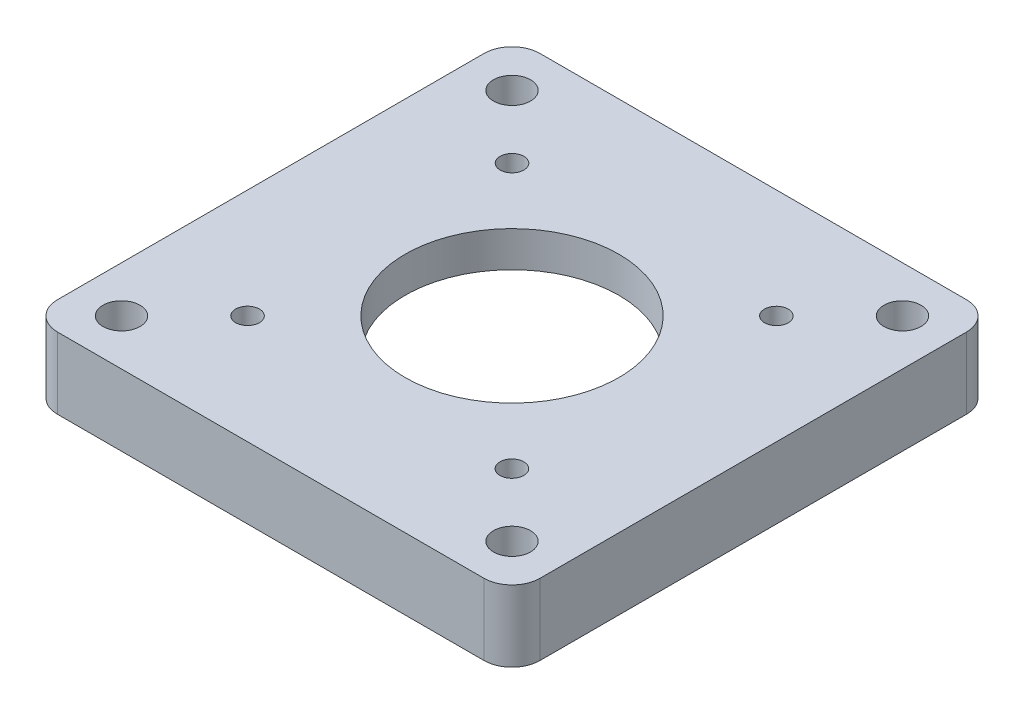
ISO-10303-21;
HEADER;
FILE_DESCRIPTION(('STEP AP214'),'2;1');
FILE_NAME('part.step','',(''),(''),'','','');
FILE_SCHEMA(('AUTOMOTIVE_DESIGN { 1 0 10303 214 1 1 1 1 }'));
ENDSEC;
DATA;
#1=APPLICATION_CONTEXT('core data for automotive mechanical design processes');
#2=APPLICATION_PROTOCOL_DEFINITION('international standard','automotive_design',2000,#1);
#3=PRODUCT_CONTEXT('',#1,'mechanical');
#4=PRODUCT('Part','Part','',(#3));
#5=PRODUCT_RELATED_PRODUCT_CATEGORY('part','',(#4));
#6=PRODUCT_DEFINITION_FORMATION('','',#4);
#7=PRODUCT_DEFINITION_CONTEXT('part definition',#1,'design');
#8=PRODUCT_DEFINITION('design','',#6,#7);
#9=PRODUCT_DEFINITION_SHAPE('','',#8);
#10=(LENGTH_UNIT() NAMED_UNIT(*) SI_UNIT(.MILLI.,.METRE.));
#11=(NAMED_UNIT(*) PLANE_ANGLE_UNIT() SI_UNIT($,.RADIAN.));
#12=(NAMED_UNIT(*) SI_UNIT($,.STERADIAN.) SOLID_ANGLE_UNIT());
#13=UNCERTAINTY_MEASURE_WITH_UNIT(LENGTH_MEASURE(1.E-05),#10,'distance_accuracy_value','');
#14=(GEOMETRIC_REPRESENTATION_CONTEXT(3) GLOBAL_UNCERTAINTY_ASSIGNED_CONTEXT((#13)) GLOBAL_UNIT_ASSIGNED_CONTEXT((#10,
#11,#12)) REPRESENTATION_CONTEXT('',''));
#15=CARTESIAN_POINT('',(0.,0.,0.));
#16=DIRECTION('',(0.,0.,1.));
#17=DIRECTION('',(1.,0.,0.));
#18=AXIS2_PLACEMENT_3D('',#15,#16,#17);
#19=CARTESIAN_POINT('',(0.,-6.35,0.));
#20=DIRECTION('',(0.,1.,0.));
#21=DIRECTION('',(0.,0.,1.));
#22=AXIS2_PLACEMENT_3D('',#19,#20,#21);
#23=PLANE('',#22);
#24=CARTESIAN_POINT('',(34.8,-6.35,-34.8));
#25=DIRECTION('',(0.,-1.,0.));
#26=DIRECTION('',(0.,0.,-1.));
#27=AXIS2_PLACEMENT_3D('',#24,#25,#26);
#28=CIRCLE('',#27,3.29999999999998);
#29=CARTESIAN_POINT('',(34.8,-6.35,-38.1));
#30=VERTEX_POINT('',#29);
#31=EDGE_CURVE('E664',#30,#30,#28,.T.);
#32=ORIENTED_EDGE('',*,*,#31,.F.);
#33=EDGE_LOOP('',(#32));
#34=FACE_BOUND('',#33,.T.);
#35=CARTESIAN_POINT('',(34.8,-6.35,34.8));
#36=DIRECTION('',(0.,-1.,0.));
#37=DIRECTION('',(0.,0.,-1.));
#38=AXIS2_PLACEMENT_3D('',#35,#36,#37);
#39=CIRCLE('',#38,3.29999999999998);
#40=CARTESIAN_POINT('',(34.8,-6.35,31.5));
#41=VERTEX_POINT('',#40);
#42=EDGE_CURVE('E677',#41,#41,#39,.T.);
#43=ORIENTED_EDGE('',*,*,#42,.F.);
#44=EDGE_LOOP('',(#43));
#45=FACE_BOUND('',#44,.T.);
#46=CARTESIAN_POINT('',(-34.8,-6.35,34.8));
#47=DIRECTION('',(0.,-1.,0.));
#48=DIRECTION('',(0.,0.,-1.));
#49=AXIS2_PLACEMENT_3D('',#46,#47,#48);
#50=CIRCLE('',#49,3.29999999999998);
#51=CARTESIAN_POINT('',(-34.8,-6.35,31.5));
#52=VERTEX_POINT('',#51);
#53=EDGE_CURVE('E682',#52,#52,#50,.T.);
#54=ORIENTED_EDGE('',*,*,#53,.F.);
#55=EDGE_LOOP('',(#54));
#56=FACE_BOUND('',#55,.T.);
#57=CARTESIAN_POINT('',(-34.8,-6.35,-34.8));
#58=DIRECTION('',(0.,-1.,0.));
#59=DIRECTION('',(0.,0.,-1.));
#60=AXIS2_PLACEMENT_3D('',#57,#58,#59);
#61=CIRCLE('',#60,3.29999999999998);
#62=CARTESIAN_POINT('',(-34.8,-6.35,-38.1));
#63=VERTEX_POINT('',#62);
#64=EDGE_CURVE('E693',#63,#63,#61,.T.);
#65=ORIENTED_EDGE('',*,*,#64,.F.);
#66=EDGE_LOOP('',(#65));
#67=FACE_BOUND('',#66,.T.);
#68=DIRECTION('',(1.,0.,0.));
#69=VECTOR('',#68,1.);
#70=CARTESIAN_POINT('',(-43.,-6.35,43.));
#71=LINE('',#70,#69);
#72=CARTESIAN_POINT('',(-38.,-6.35,43.));
#73=VERTEX_POINT('',#72);
#74=CARTESIAN_POINT('',(38.,-6.35,43.));
#75=VERTEX_POINT('',#74);
#76=EDGE_CURVE('E275',#73,#75,#71,.T.);
#77=ORIENTED_EDGE('',*,*,#76,.F.);
#78=CARTESIAN_POINT('',(-38.,-6.35,38.));
#79=DIRECTION('',(0.,1.,0.));
#80=DIRECTION('',(0.,0.,1.));
#81=AXIS2_PLACEMENT_3D('',#78,#79,#80);
#82=CIRCLE('',#81,5.);
#83=CARTESIAN_POINT('',(-43.,-6.35,38.));
#84=VERTEX_POINT('',#83);
#85=EDGE_CURVE('E330',#73,#84,#82,.F.);
#86=ORIENTED_EDGE('',*,*,#85,.T.);
#87=DIRECTION('',(0.,0.,1.));
#88=VECTOR('',#87,1.);
#89=CARTESIAN_POINT('',(-43.,-6.35,-43.));
#90=LINE('',#89,#88);
#91=CARTESIAN_POINT('',(-43.,-6.35,-38.));
#92=VERTEX_POINT('',#91);
#93=EDGE_CURVE('E270',#92,#84,#90,.T.);
#94=ORIENTED_EDGE('',*,*,#93,.F.);
#95=CARTESIAN_POINT('',(-38.,-6.35,-38.));
#96=DIRECTION('',(0.,1.,0.));
#97=DIRECTION('',(0.,0.,1.));
#98=AXIS2_PLACEMENT_3D('',#95,#96,#97);
#99=CIRCLE('',#98,5.);
#100=CARTESIAN_POINT('',(-38.,-6.35,-43.));
#101=VERTEX_POINT('',#100);
#102=EDGE_CURVE('E321',#92,#101,#99,.F.);
#103=ORIENTED_EDGE('',*,*,#102,.T.);
#104=DIRECTION('',(-1.,0.,0.));
#105=VECTOR('',#104,1.);
#106=CARTESIAN_POINT('',(43.,-6.35,-43.));
#107=LINE('',#106,#105);
#108=CARTESIAN_POINT('',(38.,-6.35,-43.));
#109=VERTEX_POINT('',#108);
#110=EDGE_CURVE('E263',#109,#101,#107,.T.);
#111=ORIENTED_EDGE('',*,*,#110,.F.);
#112=CARTESIAN_POINT('',(38.,-6.35,-38.));
#113=DIRECTION('',(0.,1.,0.));
#114=DIRECTION('',(0.,0.,1.));
#115=AXIS2_PLACEMENT_3D('',#112,#113,#114);
#116=CIRCLE('',#115,5.);
#117=CARTESIAN_POINT('',(43.,-6.35,-38.));
#118=VERTEX_POINT('',#117);
#119=EDGE_CURVE('E63',#109,#118,#116,.F.);
#120=ORIENTED_EDGE('',*,*,#119,.T.);
#121=DIRECTION('',(0.,0.,-1.));
#122=VECTOR('',#121,1.);
#123=CARTESIAN_POINT('',(43.,-6.35,43.));
#124=LINE('',#123,#122);
#125=CARTESIAN_POINT('',(43.,-6.35,38.));
#126=VERTEX_POINT('',#125);
#127=EDGE_CURVE('E277',#126,#118,#124,.T.);
#128=ORIENTED_EDGE('',*,*,#127,.F.);
#129=CARTESIAN_POINT('',(38.,-6.35,38.));
#130=DIRECTION('',(0.,1.,0.));
#131=DIRECTION('',(0.,0.,1.));
#132=AXIS2_PLACEMENT_3D('',#129,#130,#131);
#133=CIRCLE('',#132,5.);
#134=EDGE_CURVE('E322',#126,#75,#133,.F.);
#135=ORIENTED_EDGE('',*,*,#134,.T.);
#136=EDGE_LOOP('',(#77,#86,#94,#103,#111,#120,#128,#135));
#137=FACE_BOUND('',#136,.T.);
#138=CARTESIAN_POINT('',(0.,-6.35,0.));
#139=DIRECTION('',(0.,-1.,0.));
#140=DIRECTION('',(0.,0.,-1.));
#141=AXIS2_PLACEMENT_3D('',#138,#139,#140);
#142=CIRCLE('',#141,36.5);
#143=CARTESIAN_POINT('',(-30.3196281768706,-6.35,20.3216669399023));
#144=VERTEX_POINT('',#143);
#145=CARTESIAN_POINT('',(-30.3196281768706,-6.35,-20.3216669399023));
#146=VERTEX_POINT('',#145);
#147=EDGE_CURVE('E169',#144,#146,#142,.T.);
#148=ORIENTED_EDGE('',*,*,#147,.F.);
#149=CARTESIAN_POINT('',(-23.55,-6.35,23.55));
#150=DIRECTION('',(0.,-1.,0.));
#151=DIRECTION('',(0.,0.,-1.));
#152=AXIS2_PLACEMENT_3D('',#149,#150,#151);
#153=CIRCLE('',#152,7.50000000000001);
#154=CARTESIAN_POINT('',(-20.3216669399023,-6.35,30.3196281768706));
#155=VERTEX_POINT('',#154);
#156=EDGE_CURVE('E187',#155,#144,#153,.T.);
#157=ORIENTED_EDGE('',*,*,#156,.F.);
#158=CARTESIAN_POINT('',(0.,-6.35,0.));
#159=DIRECTION('',(0.,-1.,0.));
#160=DIRECTION('',(0.,0.,-1.));
#161=AXIS2_PLACEMENT_3D('',#158,#159,#160);
#162=CIRCLE('',#161,36.5);
#163=CARTESIAN_POINT('',(20.3216669399023,-6.35,30.3196281768706));
#164=VERTEX_POINT('',#163);
#165=EDGE_CURVE('E192',#164,#155,#162,.T.);
#166=ORIENTED_EDGE('',*,*,#165,.F.);
#167=CARTESIAN_POINT('',(23.55,-6.35,23.55));
#168=DIRECTION('',(0.,-1.,0.));
#169=DIRECTION('',(0.,0.,-1.));
#170=AXIS2_PLACEMENT_3D('',#167,#168,#169);
#171=CIRCLE('',#170,7.50000000000001);
#172=CARTESIAN_POINT('',(30.3196281768706,-6.35,20.3216669399023));
#173=VERTEX_POINT('',#172);
#174=EDGE_CURVE('E231',#173,#164,#171,.T.);
#175=ORIENTED_EDGE('',*,*,#174,.F.);
#176=CARTESIAN_POINT('',(0.,-6.35,0.));
#177=DIRECTION('',(0.,-1.,0.));
#178=DIRECTION('',(0.,0.,-1.));
#179=AXIS2_PLACEMENT_3D('',#176,#177,#178);
#180=CIRCLE('',#179,36.5);
#181=CARTESIAN_POINT('',(30.3196281768706,-6.35,-20.3216669399023));
#182=VERTEX_POINT('',#181);
#183=EDGE_CURVE('E233',#182,#173,#180,.T.);
#184=ORIENTED_EDGE('',*,*,#183,.F.);
#185=CARTESIAN_POINT('',(23.55,-6.35,-23.55));
#186=DIRECTION('',(0.,-1.,0.));
#187=DIRECTION('',(0.,0.,-1.));
#188=AXIS2_PLACEMENT_3D('',#185,#186,#187);
#189=CIRCLE('',#188,7.50000000000001);
#190=CARTESIAN_POINT('',(20.3216669399023,-6.35,-30.3196281768706));
#191=VERTEX_POINT('',#190);
#192=EDGE_CURVE('E230',#191,#182,#189,.T.);
#193=ORIENTED_EDGE('',*,*,#192,.F.);
#194=CARTESIAN_POINT('',(0.,-6.35,0.));
#195=DIRECTION('',(0.,-1.,0.));
#196=DIRECTION('',(0.,0.,-1.));
#197=AXIS2_PLACEMENT_3D('',#194,#195,#196);
#198=CIRCLE('',#197,36.5);
#199=CARTESIAN_POINT('',(-20.3216669399022,-6.35,-30.3196281768706));
#200=VERTEX_POINT('',#199);
#201=EDGE_CURVE('E224',#200,#191,#198,.T.);
#202=ORIENTED_EDGE('',*,*,#201,.F.);
#203=CARTESIAN_POINT('',(-23.55,-6.35,-23.55));
#204=DIRECTION('',(0.,-1.,0.));
#205=DIRECTION('',(0.,0.,-1.));
#206=AXIS2_PLACEMENT_3D('',#203,#204,#205);
#207=CIRCLE('',#206,7.50000000000003);
#208=EDGE_CURVE('E219',#146,#200,#207,.T.);
#209=ORIENTED_EDGE('',*,*,#208,.F.);
#210=EDGE_LOOP('',(#148,#157,#166,#175,#184,#193,#202,#209));
#211=FACE_BOUND('',#210,.T.);
#212=ADVANCED_FACE('F44',(#34,#45,#56,#67,#137,#211),#23,.F.);
#213=CARTESIAN_POINT('',(43.,-6.35,-43.));
#214=DIRECTION('',(0.,0.,-1.));
#215=DIRECTION('',(-1.,0.,0.));
#216=AXIS2_PLACEMENT_3D('',#213,#214,#215);
#217=PLANE('',#216);
#218=ORIENTED_EDGE('',*,*,#110,.T.);
#219=DIRECTION('',(0.,1.,0.));
#220=VECTOR('',#219,1.);
#221=CARTESIAN_POINT('',(-38.,-6.35,-43.));
#222=LINE('',#221,#220);
#223=CARTESIAN_POINT('',(-38.,6.35,-43.));
#224=VERTEX_POINT('',#223);
#225=EDGE_CURVE('E11',#101,#224,#222,.T.);
#226=ORIENTED_EDGE('',*,*,#225,.T.);
#227=DIRECTION('',(-1.,0.,0.));
#228=VECTOR('',#227,1.);
#229=CARTESIAN_POINT('',(43.,6.35,-43.));
#230=LINE('',#229,#228);
#231=CARTESIAN_POINT('',(38.,6.35,-43.));
#232=VERTEX_POINT('',#231);
#233=EDGE_CURVE('E244',#232,#224,#230,.T.);
#234=ORIENTED_EDGE('',*,*,#233,.F.);
#235=DIRECTION('',(0.,1.,0.));
#236=VECTOR('',#235,1.);
#237=CARTESIAN_POINT('',(38.,-6.35,-43.));
#238=LINE('',#237,#236);
#239=EDGE_CURVE('E53',#232,#109,#238,.F.);
#240=ORIENTED_EDGE('',*,*,#239,.T.);
#241=EDGE_LOOP('',(#218,#226,#234,#240));
#242=FACE_BOUND('',#241,.T.);
#243=ADVANCED_FACE('F337',(#242),#217,.T.);
#244=CARTESIAN_POINT('',(43.,-6.35,43.));
#245=DIRECTION('',(1.,0.,0.));
#246=DIRECTION('',(0.,0.,-1.));
#247=AXIS2_PLACEMENT_3D('',#244,#245,#246);
#248=PLANE('',#247);
#249=DIRECTION('',(0.,0.,-1.));
#250=VECTOR('',#249,1.);
#251=CARTESIAN_POINT('',(43.,6.35,43.));
#252=LINE('',#251,#250);
#253=CARTESIAN_POINT('',(43.,6.35,38.));
#254=VERTEX_POINT('',#253);
#255=CARTESIAN_POINT('',(43.,6.35,-38.));
#256=VERTEX_POINT('',#255);
#257=EDGE_CURVE('E268',#254,#256,#252,.T.);
#258=ORIENTED_EDGE('',*,*,#257,.F.);
#259=DIRECTION('',(0.,1.,0.));
#260=VECTOR('',#259,1.);
#261=CARTESIAN_POINT('',(43.,-6.35,38.));
#262=LINE('',#261,#260);
#263=EDGE_CURVE('E67',#254,#126,#262,.F.);
#264=ORIENTED_EDGE('',*,*,#263,.T.);
#265=ORIENTED_EDGE('',*,*,#127,.T.);
#266=DIRECTION('',(0.,1.,0.));
#267=VECTOR('',#266,1.);
#268=CARTESIAN_POINT('',(43.,-6.35,-38.));
#269=LINE('',#268,#267);
#270=EDGE_CURVE('E329',#118,#256,#269,.T.);
#271=ORIENTED_EDGE('',*,*,#270,.T.);
#272=EDGE_LOOP('',(#258,#264,#265,#271));
#273=FACE_BOUND('',#272,.T.);
#274=ADVANCED_FACE('F350',(#273),#248,.T.);
#275=CARTESIAN_POINT('',(-43.,-6.35,43.));
#276=DIRECTION('',(0.,0.,1.));
#277=DIRECTION('',(1.,0.,0.));
#278=AXIS2_PLACEMENT_3D('',#275,#276,#277);
#279=PLANE('',#278);
#280=DIRECTION('',(1.,0.,0.));
#281=VECTOR('',#280,1.);
#282=CARTESIAN_POINT('',(-43.,6.35,43.));
#283=LINE('',#282,#281);
#284=CARTESIAN_POINT('',(-38.,6.35,43.));
#285=VERTEX_POINT('',#284);
#286=CARTESIAN_POINT('',(38.,6.35,43.));
#287=VERTEX_POINT('',#286);
#288=EDGE_CURVE('E289',#285,#287,#283,.T.);
#289=ORIENTED_EDGE('',*,*,#288,.F.);
#290=DIRECTION('',(0.,1.,0.));
#291=VECTOR('',#290,1.);
#292=CARTESIAN_POINT('',(-38.,-6.35,43.));
#293=LINE('',#292,#291);
#294=EDGE_CURVE('E316',#285,#73,#293,.F.);
#295=ORIENTED_EDGE('',*,*,#294,.T.);
#296=ORIENTED_EDGE('',*,*,#76,.T.);
#297=DIRECTION('',(0.,1.,0.));
#298=VECTOR('',#297,1.);
#299=CARTESIAN_POINT('',(38.,-6.35,43.));
#300=LINE('',#299,#298);
#301=EDGE_CURVE('E315',#75,#287,#300,.T.);
#302=ORIENTED_EDGE('',*,*,#301,.T.);
#303=EDGE_LOOP('',(#289,#295,#296,#302));
#304=FACE_BOUND('',#303,.T.);
#305=ADVANCED_FACE('F358',(#304),#279,.T.);
#306=CARTESIAN_POINT('',(-43.,-6.35,-43.));
#307=DIRECTION('',(-1.,0.,0.));
#308=DIRECTION('',(0.,0.,1.));
#309=AXIS2_PLACEMENT_3D('',#306,#307,#308);
#310=PLANE('',#309);
#311=ORIENTED_EDGE('',*,*,#93,.T.);
#312=DIRECTION('',(0.,1.,0.));
#313=VECTOR('',#312,1.);
#314=CARTESIAN_POINT('',(-43.,-6.35,38.));
#315=LINE('',#314,#313);
#316=CARTESIAN_POINT('',(-43.,6.35,38.));
#317=VERTEX_POINT('',#316);
#318=EDGE_CURVE('E298',#84,#317,#315,.T.);
#319=ORIENTED_EDGE('',*,*,#318,.T.);
#320=DIRECTION('',(0.,0.,1.));
#321=VECTOR('',#320,1.);
#322=CARTESIAN_POINT('',(-43.,6.35,-43.));
#323=LINE('',#322,#321);
#324=CARTESIAN_POINT('',(-43.,6.35,-38.));
#325=VERTEX_POINT('',#324);
#326=EDGE_CURVE('E281',#325,#317,#323,.T.);
#327=ORIENTED_EDGE('',*,*,#326,.F.);
#328=DIRECTION('',(0.,1.,0.));
#329=VECTOR('',#328,1.);
#330=CARTESIAN_POINT('',(-43.,-6.35,-38.));
#331=LINE('',#330,#329);
#332=EDGE_CURVE('E276',#325,#92,#331,.F.);
#333=ORIENTED_EDGE('',*,*,#332,.T.);
#334=EDGE_LOOP('',(#311,#319,#327,#333));
#335=FACE_BOUND('',#334,.T.);
#336=ADVANCED_FACE('F365',(#335),#310,.T.);
#337=CARTESIAN_POINT('',(0.,6.35,0.));
#338=DIRECTION('',(0.,1.,0.));
#339=DIRECTION('',(0.,0.,1.));
#340=AXIS2_PLACEMENT_3D('',#337,#338,#339);
#341=PLANE('',#340);
#342=CARTESIAN_POINT('',(0.,6.35,0.));
#343=DIRECTION('',(0.,1.,0.));
#344=DIRECTION('',(0.,0.,1.));
#345=AXIS2_PLACEMENT_3D('',#342,#343,#344);
#346=CIRCLE('',#345,19.05);
#347=CARTESIAN_POINT('',(0.,6.35,19.05));
#348=VERTEX_POINT('',#347);
#349=EDGE_CURVE('E730',#348,#348,#346,.T.);
#350=ORIENTED_EDGE('',*,*,#349,.F.);
#351=EDGE_LOOP('',(#350));
#352=FACE_BOUND('',#351,.T.);
#353=CARTESIAN_POINT('',(-23.57,6.35000000000001,23.57));
#354=DIRECTION('',(0.,-1.,0.));
#355=DIRECTION('',(0.,0.,-1.));
#356=AXIS2_PLACEMENT_3D('',#353,#354,#355);
#357=CIRCLE('',#356,2.11700000000001);
#358=CARTESIAN_POINT('',(-23.57,6.35000000000001,21.453));
#359=VERTEX_POINT('',#358);
#360=EDGE_CURVE('E723',#359,#359,#357,.T.);
#361=ORIENTED_EDGE('',*,*,#360,.T.);
#362=EDGE_LOOP('',(#361));
#363=FACE_BOUND('',#362,.T.);
#364=CARTESIAN_POINT('',(23.57,6.35000000000001,-23.55));
#365=DIRECTION('',(0.,-1.,0.));
#366=DIRECTION('',(0.,0.,-1.));
#367=AXIS2_PLACEMENT_3D('',#364,#365,#366);
#368=CIRCLE('',#367,2.11700000000001);
#369=CARTESIAN_POINT('',(23.57,6.35000000000001,-25.667));
#370=VERTEX_POINT('',#369);
#371=EDGE_CURVE('E714',#370,#370,#368,.T.);
#372=ORIENTED_EDGE('',*,*,#371,.T.);
#373=EDGE_LOOP('',(#372));
#374=FACE_BOUND('',#373,.T.);
#375=CARTESIAN_POINT('',(23.57,6.35000000000001,23.59));
#376=DIRECTION('',(0.,-1.,0.));
#377=DIRECTION('',(0.,0.,-1.));
#378=AXIS2_PLACEMENT_3D('',#375,#376,#377);
#379=CIRCLE('',#378,2.11700000000001);
#380=CARTESIAN_POINT('',(23.57,6.35000000000001,21.473));
#381=VERTEX_POINT('',#380);
#382=EDGE_CURVE('E657',#381,#381,#379,.T.);
#383=ORIENTED_EDGE('',*,*,#382,.T.);
#384=EDGE_LOOP('',(#383));
#385=FACE_BOUND('',#384,.T.);
#386=CARTESIAN_POINT('',(-23.57,6.35000000000001,-23.57));
#387=DIRECTION('',(0.,-1.,0.));
#388=DIRECTION('',(0.,0.,-1.));
#389=AXIS2_PLACEMENT_3D('',#386,#387,#388);
#390=CIRCLE('',#389,2.11700000000001);
#391=CARTESIAN_POINT('',(-23.57,6.35000000000001,-25.687));
#392=VERTEX_POINT('',#391);
#393=EDGE_CURVE('E660',#392,#392,#390,.T.);
#394=ORIENTED_EDGE('',*,*,#393,.T.);
#395=EDGE_LOOP('',(#394));
#396=FACE_BOUND('',#395,.T.);
#397=CARTESIAN_POINT('',(34.8,6.35,-34.8));
#398=DIRECTION('',(0.,-1.,0.));
#399=DIRECTION('',(0.,0.,-1.));
#400=AXIS2_PLACEMENT_3D('',#397,#398,#399);
#401=CIRCLE('',#400,3.29999999999998);
#402=CARTESIAN_POINT('',(34.8,6.35,-38.1));
#403=VERTEX_POINT('',#402);
#404=EDGE_CURVE('E674',#403,#403,#401,.T.);
#405=ORIENTED_EDGE('',*,*,#404,.T.);
#406=EDGE_LOOP('',(#405));
#407=FACE_BOUND('',#406,.T.);
#408=CARTESIAN_POINT('',(34.8,6.35,34.8));
#409=DIRECTION('',(0.,-1.,0.));
#410=DIRECTION('',(0.,0.,-1.));
#411=AXIS2_PLACEMENT_3D('',#408,#409,#410);
#412=CIRCLE('',#411,3.29999999999998);
#413=CARTESIAN_POINT('',(34.8,6.35,31.5));
#414=VERTEX_POINT('',#413);
#415=EDGE_CURVE('E678',#414,#414,#412,.T.);
#416=ORIENTED_EDGE('',*,*,#415,.T.);
#417=EDGE_LOOP('',(#416));
#418=FACE_BOUND('',#417,.T.);
#419=CARTESIAN_POINT('',(-34.8,6.35,34.8));
#420=DIRECTION('',(0.,-1.,0.));
#421=DIRECTION('',(0.,0.,-1.));
#422=AXIS2_PLACEMENT_3D('',#419,#420,#421);
#423=CIRCLE('',#422,3.29999999999998);
#424=CARTESIAN_POINT('',(-34.8,6.35,31.5));
#425=VERTEX_POINT('',#424);
#426=EDGE_CURVE('E687',#425,#425,#423,.T.);
#427=ORIENTED_EDGE('',*,*,#426,.T.);
#428=EDGE_LOOP('',(#427));
#429=FACE_BOUND('',#428,.T.);
#430=CARTESIAN_POINT('',(-34.8,6.35,-34.8));
#431=DIRECTION('',(0.,-1.,0.));
#432=DIRECTION('',(0.,0.,-1.));
#433=AXIS2_PLACEMENT_3D('',#430,#431,#432);
#434=CIRCLE('',#433,3.29999999999998);
#435=CARTESIAN_POINT('',(-34.8,6.35,-38.1));
#436=VERTEX_POINT('',#435);
#437=EDGE_CURVE('E198',#436,#436,#434,.T.);
#438=ORIENTED_EDGE('',*,*,#437,.T.);
#439=EDGE_LOOP('',(#438));
#440=FACE_BOUND('',#439,.T.);
#441=ORIENTED_EDGE('',*,*,#326,.T.);
#442=CARTESIAN_POINT('',(-38.,6.35,38.));
#443=DIRECTION('',(0.,1.,0.));
#444=DIRECTION('',(0.,0.,1.));
#445=AXIS2_PLACEMENT_3D('',#442,#443,#444);
#446=CIRCLE('',#445,5.);
#447=EDGE_CURVE('E310',#317,#285,#446,.T.);
#448=ORIENTED_EDGE('',*,*,#447,.T.);
#449=ORIENTED_EDGE('',*,*,#288,.T.);
#450=CARTESIAN_POINT('',(38.,6.35,38.));
#451=DIRECTION('',(0.,1.,0.));
#452=DIRECTION('',(0.,0.,1.));
#453=AXIS2_PLACEMENT_3D('',#450,#451,#452);
#454=CIRCLE('',#453,5.);
#455=EDGE_CURVE('E308',#287,#254,#454,.T.);
#456=ORIENTED_EDGE('',*,*,#455,.T.);
#457=ORIENTED_EDGE('',*,*,#257,.T.);
#458=CARTESIAN_POINT('',(38.,6.35,-38.));
#459=DIRECTION('',(0.,1.,0.));
#460=DIRECTION('',(0.,0.,1.));
#461=AXIS2_PLACEMENT_3D('',#458,#459,#460);
#462=CIRCLE('',#461,5.);
#463=EDGE_CURVE('E299',#256,#232,#462,.T.);
#464=ORIENTED_EDGE('',*,*,#463,.T.);
#465=ORIENTED_EDGE('',*,*,#233,.T.);
#466=CARTESIAN_POINT('',(-38.,6.35,-38.));
#467=DIRECTION('',(0.,1.,0.));
#468=DIRECTION('',(0.,0.,1.));
#469=AXIS2_PLACEMENT_3D('',#466,#467,#468);
#470=CIRCLE('',#469,5.);
#471=EDGE_CURVE('E302',#224,#325,#470,.T.);
#472=ORIENTED_EDGE('',*,*,#471,.T.);
#473=EDGE_LOOP('',(#441,#448,#449,#456,#457,#464,#465,#472));
#474=FACE_BOUND('',#473,.T.);
#475=ADVANCED_FACE('F349',(#352,#363,#374,#385,#396,#407,#418,#429,#440,#474),#341,.T.);
#476=CARTESIAN_POINT('',(0.,0.,0.));
#477=DIRECTION('',(0.,-1.,0.));
#478=DIRECTION('',(0.,0.,-1.));
#479=AXIS2_PLACEMENT_3D('',#476,#477,#478);
#480=CYLINDRICAL_SURFACE('',#479,36.5);
#481=ORIENTED_EDGE('',*,*,#147,.T.);
#482=DIRECTION('',(0.,-1.,0.));
#483=VECTOR('',#482,1.);
#484=CARTESIAN_POINT('',(-30.3196281768706,0.,-20.3216669399023));
#485=LINE('',#484,#483);
#486=CARTESIAN_POINT('',(-30.3196281768706,0.,-20.3216669399023));
#487=VERTEX_POINT('',#486);
#488=EDGE_CURVE('E161',#487,#146,#485,.T.);
#489=ORIENTED_EDGE('',*,*,#488,.F.);
#490=CARTESIAN_POINT('',(0.,0.,0.));
#491=DIRECTION('',(0.,-1.,0.));
#492=DIRECTION('',(0.,0.,-1.));
#493=AXIS2_PLACEMENT_3D('',#490,#491,#492);
#494=CIRCLE('',#493,36.5);
#495=CARTESIAN_POINT('',(-30.3196281768706,0.,20.3216669399023));
#496=VERTEX_POINT('',#495);
#497=EDGE_CURVE('E164',#496,#487,#494,.T.);
#498=ORIENTED_EDGE('',*,*,#497,.F.);
#499=DIRECTION('',(0.,-1.,0.));
#500=VECTOR('',#499,1.);
#501=CARTESIAN_POINT('',(-30.3196281768706,0.,20.3216669399023));
#502=LINE('',#501,#500);
#503=EDGE_CURVE('E245',#496,#144,#502,.T.);
#504=ORIENTED_EDGE('',*,*,#503,.T.);
#505=EDGE_LOOP('',(#481,#489,#498,#504));
#506=FACE_BOUND('',#505,.T.);
#507=ADVANCED_FACE('F162',(#506),#480,.F.);
#508=CARTESIAN_POINT('',(-23.55,0.,23.55));
#509=DIRECTION('',(0.,-1.,0.));
#510=DIRECTION('',(0.,0.,-1.));
#511=AXIS2_PLACEMENT_3D('',#508,#509,#510);
#512=CYLINDRICAL_SURFACE('',#511,7.50000000000001);
#513=ORIENTED_EDGE('',*,*,#156,.T.);
#514=ORIENTED_EDGE('',*,*,#503,.F.);
#515=CARTESIAN_POINT('',(-23.55,0.,23.55));
#516=DIRECTION('',(0.,-1.,0.));
#517=DIRECTION('',(0.,0.,-1.));
#518=AXIS2_PLACEMENT_3D('',#515,#516,#517);
#519=CIRCLE('',#518,7.50000000000001);
#520=CARTESIAN_POINT('',(-20.3216669399023,0.,30.3196281768706));
#521=VERTEX_POINT('',#520);
#522=EDGE_CURVE('E172',#521,#496,#519,.T.);
#523=ORIENTED_EDGE('',*,*,#522,.F.);
#524=DIRECTION('',(0.,-1.,0.));
#525=VECTOR('',#524,1.);
#526=CARTESIAN_POINT('',(-20.3216669399023,0.,30.3196281768706));
#527=LINE('',#526,#525);
#528=EDGE_CURVE('E248',#521,#155,#527,.T.);
#529=ORIENTED_EDGE('',*,*,#528,.T.);
#530=EDGE_LOOP('',(#513,#514,#523,#529));
#531=FACE_BOUND('',#530,.T.);
#532=ADVANCED_FACE('F445',(#531),#512,.F.);
#533=CARTESIAN_POINT('',(0.,0.,0.));
#534=DIRECTION('',(0.,-1.,0.));
#535=DIRECTION('',(0.,0.,-1.));
#536=AXIS2_PLACEMENT_3D('',#533,#534,#535);
#537=CYLINDRICAL_SURFACE('',#536,36.5);
#538=ORIENTED_EDGE('',*,*,#165,.T.);
#539=ORIENTED_EDGE('',*,*,#528,.F.);
#540=CARTESIAN_POINT('',(0.,0.,0.));
#541=DIRECTION('',(0.,-1.,0.));
#542=DIRECTION('',(0.,0.,-1.));
#543=AXIS2_PLACEMENT_3D('',#540,#541,#542);
#544=CIRCLE('',#543,36.5);
#545=CARTESIAN_POINT('',(20.3216669399023,0.,30.3196281768706));
#546=VERTEX_POINT('',#545);
#547=EDGE_CURVE('E213',#546,#521,#544,.T.);
#548=ORIENTED_EDGE('',*,*,#547,.F.);
#549=DIRECTION('',(0.,-1.,0.));
#550=VECTOR('',#549,1.);
#551=CARTESIAN_POINT('',(20.3216669399023,0.,30.3196281768706));
#552=LINE('',#551,#550);
#553=EDGE_CURVE('E250',#546,#164,#552,.T.);
#554=ORIENTED_EDGE('',*,*,#553,.T.);
#555=EDGE_LOOP('',(#538,#539,#548,#554));
#556=FACE_BOUND('',#555,.T.);
#557=ADVANCED_FACE('F443',(#556),#537,.F.);
#558=CARTESIAN_POINT('',(23.55,0.,23.55));
#559=DIRECTION('',(0.,-1.,0.));
#560=DIRECTION('',(0.,0.,-1.));
#561=AXIS2_PLACEMENT_3D('',#558,#559,#560);
#562=CYLINDRICAL_SURFACE('',#561,7.50000000000001);
#563=ORIENTED_EDGE('',*,*,#174,.T.);
#564=ORIENTED_EDGE('',*,*,#553,.F.);
#565=CARTESIAN_POINT('',(23.55,0.,23.55));
#566=DIRECTION('',(0.,-1.,0.));
#567=DIRECTION('',(0.,0.,-1.));
#568=AXIS2_PLACEMENT_3D('',#565,#566,#567);
#569=CIRCLE('',#568,7.50000000000001);
#570=CARTESIAN_POINT('',(30.3196281768706,0.,20.3216669399023));
#571=VERTEX_POINT('',#570);
#572=EDGE_CURVE('E207',#571,#546,#569,.T.);
#573=ORIENTED_EDGE('',*,*,#572,.F.);
#574=DIRECTION('',(0.,-1.,0.));
#575=VECTOR('',#574,1.);
#576=CARTESIAN_POINT('',(30.3196281768706,0.,20.3216669399023));
#577=LINE('',#576,#575);
#578=EDGE_CURVE('E252',#571,#173,#577,.T.);
#579=ORIENTED_EDGE('',*,*,#578,.T.);
#580=EDGE_LOOP('',(#563,#564,#573,#579));
#581=FACE_BOUND('',#580,.T.);
#582=ADVANCED_FACE('F447',(#581),#562,.F.);
#583=CARTESIAN_POINT('',(0.,0.,0.));
#584=DIRECTION('',(0.,-1.,0.));
#585=DIRECTION('',(0.,0.,-1.));
#586=AXIS2_PLACEMENT_3D('',#583,#584,#585);
#587=CYLINDRICAL_SURFACE('',#586,36.5);
#588=ORIENTED_EDGE('',*,*,#183,.T.);
#589=ORIENTED_EDGE('',*,*,#578,.F.);
#590=CARTESIAN_POINT('',(0.,0.,0.));
#591=DIRECTION('',(0.,-1.,0.));
#592=DIRECTION('',(0.,0.,-1.));
#593=AXIS2_PLACEMENT_3D('',#590,#591,#592);
#594=CIRCLE('',#593,36.5);
#595=CARTESIAN_POINT('',(30.3196281768706,0.,-20.3216669399023));
#596=VERTEX_POINT('',#595);
#597=EDGE_CURVE('E202',#596,#571,#594,.T.);
#598=ORIENTED_EDGE('',*,*,#597,.F.);
#599=DIRECTION('',(0.,-1.,0.));
#600=VECTOR('',#599,1.);
#601=CARTESIAN_POINT('',(30.3196281768706,0.,-20.3216669399023));
#602=LINE('',#601,#600);
#603=EDGE_CURVE('E254',#596,#182,#602,.T.);
#604=ORIENTED_EDGE('',*,*,#603,.T.);
#605=EDGE_LOOP('',(#588,#589,#598,#604));
#606=FACE_BOUND('',#605,.T.);
#607=ADVANCED_FACE('F452',(#606),#587,.F.);
#608=CARTESIAN_POINT('',(23.55,0.,-23.55));
#609=DIRECTION('',(0.,-1.,0.));
#610=DIRECTION('',(0.,0.,-1.));
#611=AXIS2_PLACEMENT_3D('',#608,#609,#610);
#612=CYLINDRICAL_SURFACE('',#611,7.50000000000001);
#613=ORIENTED_EDGE('',*,*,#192,.T.);
#614=ORIENTED_EDGE('',*,*,#603,.F.);
#615=CARTESIAN_POINT('',(23.55,0.,-23.55));
#616=DIRECTION('',(0.,-1.,0.));
#617=DIRECTION('',(0.,0.,-1.));
#618=AXIS2_PLACEMENT_3D('',#615,#616,#617);
#619=CIRCLE('',#618,7.50000000000001);
#620=CARTESIAN_POINT('',(20.3216669399023,0.,-30.3196281768706));
#621=VERTEX_POINT('',#620);
#622=EDGE_CURVE('E203',#621,#596,#619,.T.);
#623=ORIENTED_EDGE('',*,*,#622,.F.);
#624=DIRECTION('',(0.,-1.,0.));
#625=VECTOR('',#624,1.);
#626=CARTESIAN_POINT('',(20.3216669399023,0.,-30.3196281768706));
#627=LINE('',#626,#625);
#628=EDGE_CURVE('E256',#621,#191,#627,.T.);
#629=ORIENTED_EDGE('',*,*,#628,.T.);
#630=EDGE_LOOP('',(#613,#614,#623,#629));
#631=FACE_BOUND('',#630,.T.);
#632=ADVANCED_FACE('F460',(#631),#612,.F.);
#633=CARTESIAN_POINT('',(0.,0.,0.));
#634=DIRECTION('',(0.,-1.,0.));
#635=DIRECTION('',(0.,0.,-1.));
#636=AXIS2_PLACEMENT_3D('',#633,#634,#635);
#637=CYLINDRICAL_SURFACE('',#636,36.5);
#638=ORIENTED_EDGE('',*,*,#201,.T.);
#639=ORIENTED_EDGE('',*,*,#628,.F.);
#640=CARTESIAN_POINT('',(0.,0.,0.));
#641=DIRECTION('',(0.,-1.,0.));
#642=DIRECTION('',(0.,0.,-1.));
#643=AXIS2_PLACEMENT_3D('',#640,#641,#642);
#644=CIRCLE('',#643,36.5);
#645=CARTESIAN_POINT('',(-20.3216669399022,0.,-30.3196281768706));
#646=VERTEX_POINT('',#645);
#647=EDGE_CURVE('E181',#646,#621,#644,.T.);
#648=ORIENTED_EDGE('',*,*,#647,.F.);
#649=DIRECTION('',(0.,-1.,0.));
#650=VECTOR('',#649,1.);
#651=CARTESIAN_POINT('',(-20.3216669399022,0.,-30.3196281768706));
#652=LINE('',#651,#650);
#653=EDGE_CURVE('E171',#646,#200,#652,.T.);
#654=ORIENTED_EDGE('',*,*,#653,.T.);
#655=EDGE_LOOP('',(#638,#639,#648,#654));
#656=FACE_BOUND('',#655,.T.);
#657=ADVANCED_FACE('F463',(#656),#637,.F.);
#658=CARTESIAN_POINT('',(-23.55,0.,-23.55));
#659=DIRECTION('',(0.,-1.,0.));
#660=DIRECTION('',(0.,0.,-1.));
#661=AXIS2_PLACEMENT_3D('',#658,#659,#660);
#662=CYLINDRICAL_SURFACE('',#661,7.50000000000003);
#663=ORIENTED_EDGE('',*,*,#208,.T.);
#664=ORIENTED_EDGE('',*,*,#653,.F.);
#665=CARTESIAN_POINT('',(-23.55,0.,-23.55));
#666=DIRECTION('',(0.,-1.,0.));
#667=DIRECTION('',(0.,0.,-1.));
#668=AXIS2_PLACEMENT_3D('',#665,#666,#667);
#669=CIRCLE('',#668,7.50000000000003);
#670=EDGE_CURVE('E179',#487,#646,#669,.T.);
#671=ORIENTED_EDGE('',*,*,#670,.F.);
#672=ORIENTED_EDGE('',*,*,#488,.T.);
#673=EDGE_LOOP('',(#663,#664,#671,#672));
#674=FACE_BOUND('',#673,.T.);
#675=ADVANCED_FACE('F177',(#674),#662,.F.);
#676=CARTESIAN_POINT('',(-11.775,0.,-11.775));
#677=DIRECTION('',(0.,-1.,0.));
#678=DIRECTION('',(0.,0.,-1.));
#679=AXIS2_PLACEMENT_3D('',#676,#677,#678);
#680=PLANE('',#679);
#681=CARTESIAN_POINT('',(0.,0.,0.));
#682=DIRECTION('',(0.,-1.,0.));
#683=DIRECTION('',(0.,0.,-1.));
#684=AXIS2_PLACEMENT_3D('',#681,#682,#683);
#685=CIRCLE('',#684,19.05);
#686=CARTESIAN_POINT('',(0.,0.,-19.05));
#687=VERTEX_POINT('',#686);
#688=EDGE_CURVE('E640',#687,#687,#685,.T.);
#689=ORIENTED_EDGE('',*,*,#688,.F.);
#690=EDGE_LOOP('',(#689));
#691=FACE_BOUND('',#690,.T.);
#692=CARTESIAN_POINT('',(-23.57,0.,23.57));
#693=DIRECTION('',(0.,-1.,0.));
#694=DIRECTION('',(0.,0.,-1.));
#695=AXIS2_PLACEMENT_3D('',#692,#693,#694);
#696=CIRCLE('',#695,2.11700000000001);
#697=CARTESIAN_POINT('',(-23.57,0.,21.453));
#698=VERTEX_POINT('',#697);
#699=EDGE_CURVE('E641',#698,#698,#696,.T.);
#700=ORIENTED_EDGE('',*,*,#699,.F.);
#701=EDGE_LOOP('',(#700));
#702=FACE_BOUND('',#701,.T.);
#703=CARTESIAN_POINT('',(23.57,0.,-23.55));
#704=DIRECTION('',(0.,-1.,0.));
#705=DIRECTION('',(0.,0.,-1.));
#706=AXIS2_PLACEMENT_3D('',#703,#704,#705);
#707=CIRCLE('',#706,2.11700000000001);
#708=CARTESIAN_POINT('',(23.57,0.,-25.667));
#709=VERTEX_POINT('',#708);
#710=EDGE_CURVE('E650',#709,#709,#707,.T.);
#711=ORIENTED_EDGE('',*,*,#710,.F.);
#712=EDGE_LOOP('',(#711));
#713=FACE_BOUND('',#712,.T.);
#714=CARTESIAN_POINT('',(23.57,0.,23.59));
#715=DIRECTION('',(0.,-1.,0.));
#716=DIRECTION('',(0.,0.,-1.));
#717=AXIS2_PLACEMENT_3D('',#714,#715,#716);
#718=CIRCLE('',#717,2.11700000000001);
#719=CARTESIAN_POINT('',(23.57,0.,21.473));
#720=VERTEX_POINT('',#719);
#721=EDGE_CURVE('E651',#720,#720,#718,.T.);
#722=ORIENTED_EDGE('',*,*,#721,.F.);
#723=EDGE_LOOP('',(#722));
#724=FACE_BOUND('',#723,.T.);
#725=CARTESIAN_POINT('',(-23.57,0.,-23.57));
#726=DIRECTION('',(0.,-1.,0.));
#727=DIRECTION('',(0.,0.,-1.));
#728=AXIS2_PLACEMENT_3D('',#725,#726,#727);
#729=CIRCLE('',#728,2.11700000000001);
#730=CARTESIAN_POINT('',(-23.57,0.,-25.687));
#731=VERTEX_POINT('',#730);
#732=EDGE_CURVE('E652',#731,#731,#729,.T.);
#733=ORIENTED_EDGE('',*,*,#732,.F.);
#734=EDGE_LOOP('',(#733));
#735=FACE_BOUND('',#734,.T.);
#736=ORIENTED_EDGE('',*,*,#497,.T.);
#737=ORIENTED_EDGE('',*,*,#670,.T.);
#738=ORIENTED_EDGE('',*,*,#647,.T.);
#739=ORIENTED_EDGE('',*,*,#622,.T.);
#740=ORIENTED_EDGE('',*,*,#597,.T.);
#741=ORIENTED_EDGE('',*,*,#572,.T.);
#742=ORIENTED_EDGE('',*,*,#547,.T.);
#743=ORIENTED_EDGE('',*,*,#522,.T.);
#744=EDGE_LOOP('',(#736,#737,#738,#739,#740,#741,#742,#743));
#745=FACE_BOUND('',#744,.T.);
#746=ADVANCED_FACE('F183',(#691,#702,#713,#724,#735,#745),#680,.T.);
#747=CARTESIAN_POINT('',(-34.8,-6.35,-34.8));
#748=DIRECTION('',(0.,-1.,0.));
#749=DIRECTION('',(0.,0.,-1.));
#750=AXIS2_PLACEMENT_3D('',#747,#748,#749);
#751=CYLINDRICAL_SURFACE('',#750,3.29999999999998);
#752=ORIENTED_EDGE('',*,*,#437,.F.);
#753=EDGE_LOOP('',(#752));
#754=FACE_BOUND('',#753,.T.);
#755=ORIENTED_EDGE('',*,*,#64,.T.);
#756=EDGE_LOOP('',(#755));
#757=FACE_BOUND('',#756,.T.);
#758=ADVANCED_FACE('F434',(#754,#757),#751,.F.);
#759=CARTESIAN_POINT('',(-34.8,-6.35,34.8));
#760=DIRECTION('',(0.,-1.,0.));
#761=DIRECTION('',(0.,0.,-1.));
#762=AXIS2_PLACEMENT_3D('',#759,#760,#761);
#763=CYLINDRICAL_SURFACE('',#762,3.29999999999998);
#764=ORIENTED_EDGE('',*,*,#426,.F.);
#765=EDGE_LOOP('',(#764));
#766=FACE_BOUND('',#765,.T.);
#767=ORIENTED_EDGE('',*,*,#53,.T.);
#768=EDGE_LOOP('',(#767));
#769=FACE_BOUND('',#768,.T.);
#770=ADVANCED_FACE('F431',(#766,#769),#763,.F.);
#771=CARTESIAN_POINT('',(34.8,-6.35,34.8));
#772=DIRECTION('',(0.,-1.,0.));
#773=DIRECTION('',(0.,0.,-1.));
#774=AXIS2_PLACEMENT_3D('',#771,#772,#773);
#775=CYLINDRICAL_SURFACE('',#774,3.29999999999998);
#776=ORIENTED_EDGE('',*,*,#415,.F.);
#777=EDGE_LOOP('',(#776));
#778=FACE_BOUND('',#777,.T.);
#779=ORIENTED_EDGE('',*,*,#42,.T.);
#780=EDGE_LOOP('',(#779));
#781=FACE_BOUND('',#780,.T.);
#782=ADVANCED_FACE('F430',(#778,#781),#775,.F.);
#783=CARTESIAN_POINT('',(34.8,-6.35,-34.8));
#784=DIRECTION('',(0.,-1.,0.));
#785=DIRECTION('',(0.,0.,-1.));
#786=AXIS2_PLACEMENT_3D('',#783,#784,#785);
#787=CYLINDRICAL_SURFACE('',#786,3.29999999999998);
#788=ORIENTED_EDGE('',*,*,#404,.F.);
#789=EDGE_LOOP('',(#788));
#790=FACE_BOUND('',#789,.T.);
#791=ORIENTED_EDGE('',*,*,#31,.T.);
#792=EDGE_LOOP('',(#791));
#793=FACE_BOUND('',#792,.T.);
#794=ADVANCED_FACE('F421',(#790,#793),#787,.F.);
#795=CARTESIAN_POINT('',(-23.57,0.,-23.57));
#796=DIRECTION('',(0.,-1.,0.));
#797=DIRECTION('',(0.,0.,-1.));
#798=AXIS2_PLACEMENT_3D('',#795,#796,#797);
#799=CYLINDRICAL_SURFACE('',#798,2.11700000000001);
#800=ORIENTED_EDGE('',*,*,#393,.F.);
#801=EDGE_LOOP('',(#800));
#802=FACE_BOUND('',#801,.T.);
#803=ORIENTED_EDGE('',*,*,#732,.T.);
#804=EDGE_LOOP('',(#803));
#805=FACE_BOUND('',#804,.T.);
#806=ADVANCED_FACE('F420',(#802,#805),#799,.F.);
#807=CARTESIAN_POINT('',(23.57,0.,23.59));
#808=DIRECTION('',(0.,-1.,0.));
#809=DIRECTION('',(0.,0.,-1.));
#810=AXIS2_PLACEMENT_3D('',#807,#808,#809);
#811=CYLINDRICAL_SURFACE('',#810,2.11700000000001);
#812=ORIENTED_EDGE('',*,*,#382,.F.);
#813=EDGE_LOOP('',(#812));
#814=FACE_BOUND('',#813,.T.);
#815=ORIENTED_EDGE('',*,*,#721,.T.);
#816=EDGE_LOOP('',(#815));
#817=FACE_BOUND('',#816,.T.);
#818=ADVANCED_FACE('F411',(#814,#817),#811,.F.);
#819=CARTESIAN_POINT('',(23.57,0.,-23.55));
#820=DIRECTION('',(0.,-1.,0.));
#821=DIRECTION('',(0.,0.,-1.));
#822=AXIS2_PLACEMENT_3D('',#819,#820,#821);
#823=CYLINDRICAL_SURFACE('',#822,2.11700000000001);
#824=ORIENTED_EDGE('',*,*,#371,.F.);
#825=EDGE_LOOP('',(#824));
#826=FACE_BOUND('',#825,.T.);
#827=ORIENTED_EDGE('',*,*,#710,.T.);
#828=EDGE_LOOP('',(#827));
#829=FACE_BOUND('',#828,.T.);
#830=ADVANCED_FACE('F410',(#826,#829),#823,.F.);
#831=CARTESIAN_POINT('',(-23.57,0.,23.57));
#832=DIRECTION('',(0.,-1.,0.));
#833=DIRECTION('',(0.,0.,-1.));
#834=AXIS2_PLACEMENT_3D('',#831,#832,#833);
#835=CYLINDRICAL_SURFACE('',#834,2.11700000000001);
#836=ORIENTED_EDGE('',*,*,#360,.F.);
#837=EDGE_LOOP('',(#836));
#838=FACE_BOUND('',#837,.T.);
#839=ORIENTED_EDGE('',*,*,#699,.T.);
#840=EDGE_LOOP('',(#839));
#841=FACE_BOUND('',#840,.T.);
#842=ADVANCED_FACE('F396',(#838,#841),#835,.F.);
#843=CARTESIAN_POINT('',(0.,6.35,0.));
#844=DIRECTION('',(0.,1.,0.));
#845=DIRECTION('',(0.,0.,1.));
#846=AXIS2_PLACEMENT_3D('',#843,#844,#845);
#847=CYLINDRICAL_SURFACE('',#846,19.05);
#848=ORIENTED_EDGE('',*,*,#688,.T.);
#849=EDGE_LOOP('',(#848));
#850=FACE_BOUND('',#849,.T.);
#851=ORIENTED_EDGE('',*,*,#349,.T.);
#852=EDGE_LOOP('',(#851));
#853=FACE_BOUND('',#852,.T.);
#854=ADVANCED_FACE('F399',(#850,#853),#847,.F.);
#855=CARTESIAN_POINT('',(-38.,-6.35,38.));
#856=DIRECTION('',(0.,1.,0.));
#857=DIRECTION('',(0.,0.,1.));
#858=AXIS2_PLACEMENT_3D('',#855,#856,#857);
#859=CYLINDRICAL_SURFACE('',#858,5.);
#860=ORIENTED_EDGE('',*,*,#85,.F.);
#861=ORIENTED_EDGE('',*,*,#294,.F.);
#862=ORIENTED_EDGE('',*,*,#447,.F.);
#863=ORIENTED_EDGE('',*,*,#318,.F.);
#864=EDGE_LOOP('',(#860,#861,#862,#863));
#865=FACE_BOUND('',#864,.T.);
#866=ADVANCED_FACE('F363',(#865),#859,.T.);
#867=CARTESIAN_POINT('',(38.,-6.35,38.));
#868=DIRECTION('',(0.,1.,0.));
#869=DIRECTION('',(0.,0.,1.));
#870=AXIS2_PLACEMENT_3D('',#867,#868,#869);
#871=CYLINDRICAL_SURFACE('',#870,5.);
#872=ORIENTED_EDGE('',*,*,#134,.F.);
#873=ORIENTED_EDGE('',*,*,#263,.F.);
#874=ORIENTED_EDGE('',*,*,#455,.F.);
#875=ORIENTED_EDGE('',*,*,#301,.F.);
#876=EDGE_LOOP('',(#872,#873,#874,#875));
#877=FACE_BOUND('',#876,.T.);
#878=ADVANCED_FACE('F352',(#877),#871,.T.);
#879=CARTESIAN_POINT('',(-38.,-6.35,-38.));
#880=DIRECTION('',(0.,1.,0.));
#881=DIRECTION('',(0.,0.,1.));
#882=AXIS2_PLACEMENT_3D('',#879,#880,#881);
#883=CYLINDRICAL_SURFACE('',#882,5.);
#884=ORIENTED_EDGE('',*,*,#102,.F.);
#885=ORIENTED_EDGE('',*,*,#332,.F.);
#886=ORIENTED_EDGE('',*,*,#471,.F.);
#887=ORIENTED_EDGE('',*,*,#225,.F.);
#888=EDGE_LOOP('',(#884,#885,#886,#887));
#889=FACE_BOUND('',#888,.T.);
#890=ADVANCED_FACE('F370',(#889),#883,.T.);
#891=CARTESIAN_POINT('',(38.,-6.35,-38.));
#892=DIRECTION('',(0.,1.,0.));
#893=DIRECTION('',(0.,0.,1.));
#894=AXIS2_PLACEMENT_3D('',#891,#892,#893);
#895=CYLINDRICAL_SURFACE('',#894,5.);
#896=ORIENTED_EDGE('',*,*,#119,.F.);
#897=ORIENTED_EDGE('',*,*,#239,.F.);
#898=ORIENTED_EDGE('',*,*,#463,.F.);
#899=ORIENTED_EDGE('',*,*,#270,.F.);
#900=EDGE_LOOP('',(#896,#897,#898,#899));
#901=FACE_BOUND('',#900,.T.);
#902=ADVANCED_FACE('F50',(#901),#895,.T.);
#903=CLOSED_SHELL('',(#212,#243,#274,#305,#336,#475,#507,#532,#557,#582,#607,#632,#657,#675,
#746,#758,#770,#782,#794,#806,#818,#830,#842,#854,#866,#878,#890,#902));
#904=MANIFOLD_SOLID_BREP('B2',#903);
#905=ADVANCED_BREP_SHAPE_REPRESENTATION('',(#18,#904),#14);
#906=SHAPE_DEFINITION_REPRESENTATION(#9,#905);
ENDSEC;
END-ISO-10303-21;
